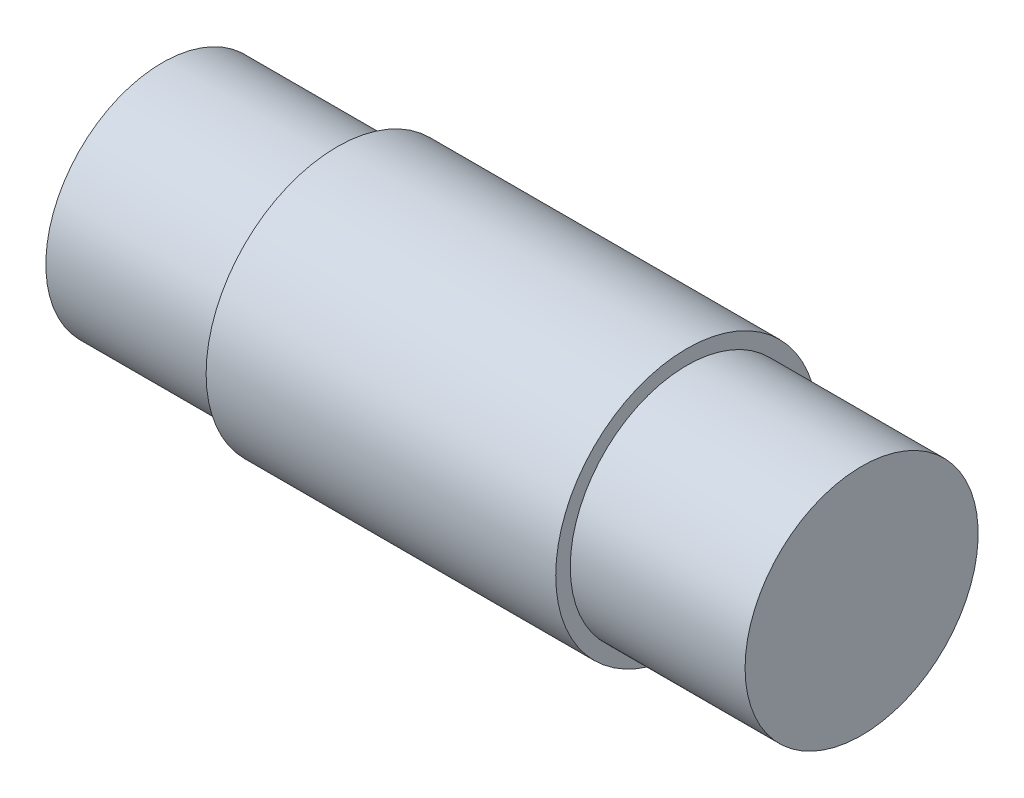
ISO-10303-21;
HEADER;
FILE_DESCRIPTION(('STEP AP214'),'2;1');
FILE_NAME('part.step','',(''),(''),'','','');
FILE_SCHEMA(('AUTOMOTIVE_DESIGN { 1 0 10303 214 1 1 1 1 }'));
ENDSEC;
DATA;
#1=APPLICATION_CONTEXT('core data for automotive mechanical design processes');
#2=APPLICATION_PROTOCOL_DEFINITION('international standard','automotive_design',2000,#1);
#3=PRODUCT_CONTEXT('',#1,'mechanical');
#4=PRODUCT('Part','Part','',(#3));
#5=PRODUCT_RELATED_PRODUCT_CATEGORY('part','',(#4));
#6=PRODUCT_DEFINITION_FORMATION('','',#4);
#7=PRODUCT_DEFINITION_CONTEXT('part definition',#1,'design');
#8=PRODUCT_DEFINITION('design','',#6,#7);
#9=PRODUCT_DEFINITION_SHAPE('','',#8);
#10=(LENGTH_UNIT() NAMED_UNIT(*) SI_UNIT(.MILLI.,.METRE.));
#11=(NAMED_UNIT(*) PLANE_ANGLE_UNIT() SI_UNIT($,.RADIAN.));
#12=(NAMED_UNIT(*) SI_UNIT($,.STERADIAN.) SOLID_ANGLE_UNIT());
#13=UNCERTAINTY_MEASURE_WITH_UNIT(LENGTH_MEASURE(1.E-05),#10,'distance_accuracy_value','');
#14=(GEOMETRIC_REPRESENTATION_CONTEXT(3) GLOBAL_UNCERTAINTY_ASSIGNED_CONTEXT((#13)) GLOBAL_UNIT_ASSIGNED_CONTEXT((#10,
#11,#12)) REPRESENTATION_CONTEXT('',''));
#15=CARTESIAN_POINT('',(0.,0.,0.));
#16=DIRECTION('',(0.,0.,1.));
#17=DIRECTION('',(1.,0.,0.));
#18=AXIS2_PLACEMENT_3D('',#15,#16,#17);
#19=CARTESIAN_POINT('',(2.38125,0.,0.));
#20=DIRECTION('',(-1.,0.,0.));
#21=DIRECTION('',(0.,0.,1.));
#22=AXIS2_PLACEMENT_3D('',#19,#20,#21);
#23=CYLINDRICAL_SURFACE('',#22,3.175);
#24=CARTESIAN_POINT('',(2.38125,0.,0.));
#25=DIRECTION('',(1.,0.,0.));
#26=DIRECTION('',(0.,0.,-1.));
#27=AXIS2_PLACEMENT_3D('',#24,#25,#26);
#28=CIRCLE('',#27,3.175);
#29=CARTESIAN_POINT('',(2.38125,0.,3.175));
#30=VERTEX_POINT('',#29);
#31=EDGE_CURVE('E42',#30,#30,#28,.T.);
#32=CARTESIAN_POINT('',(-2.38125,0.,0.));
#33=DIRECTION('',(1.,0.,0.));
#34=DIRECTION('',(0.,0.,-1.));
#35=AXIS2_PLACEMENT_3D('',#32,#33,#34);
#36=CIRCLE('',#35,3.175);
#37=CARTESIAN_POINT('',(-2.38125,0.,3.175));
#38=VERTEX_POINT('',#37);
#39=EDGE_CURVE('E38',#38,#38,#36,.T.);
#40=CARTESIAN_POINT('',(2.38125,0.,3.175));
#41=CARTESIAN_POINT('',(2.331640625,0.,3.175));
#42=CARTESIAN_POINT('',(2.28203125,0.,3.175));
#43=CARTESIAN_POINT('',(2.1828125,0.,3.175));
#44=CARTESIAN_POINT('',(2.133203125,0.,3.175));
#45=CARTESIAN_POINT('',(2.033984375,0.,3.175));
#46=CARTESIAN_POINT('',(1.984375,0.,3.175));
#47=CARTESIAN_POINT('',(1.88515625,0.,3.175));
#48=CARTESIAN_POINT('',(1.835546875,0.,3.175));
#49=CARTESIAN_POINT('',(1.736328125,0.,3.175));
#50=CARTESIAN_POINT('',(1.68671875,0.,3.175));
#51=CARTESIAN_POINT('',(1.5875,0.,3.175));
#52=CARTESIAN_POINT('',(1.537890625,0.,3.175));
#53=CARTESIAN_POINT('',(1.438671875,0.,3.175));
#54=CARTESIAN_POINT('',(1.3890625,0.,3.175));
#55=CARTESIAN_POINT('',(1.28984375,0.,3.175));
#56=CARTESIAN_POINT('',(1.240234375,0.,3.175));
#57=CARTESIAN_POINT('',(1.141015625,0.,3.175));
#58=CARTESIAN_POINT('',(1.09140625,0.,3.175));
#59=CARTESIAN_POINT('',(0.9921875,0.,3.175));
#60=CARTESIAN_POINT('',(0.942578125,0.,3.175));
#61=CARTESIAN_POINT('',(0.843359375,0.,3.175));
#62=CARTESIAN_POINT('',(0.79375,0.,3.175));
#63=CARTESIAN_POINT('',(0.69453125,0.,3.175));
#64=CARTESIAN_POINT('',(0.644921875,0.,3.175));
#65=CARTESIAN_POINT('',(0.545703125,0.,3.175));
#66=CARTESIAN_POINT('',(0.49609375,0.,3.175));
#67=CARTESIAN_POINT('',(0.396875,0.,3.175));
#68=CARTESIAN_POINT('',(0.347265625,0.,3.175));
#69=CARTESIAN_POINT('',(0.248046875,0.,3.175));
#70=CARTESIAN_POINT('',(0.1984375,0.,3.175));
#71=CARTESIAN_POINT('',(0.0992187499999996,0.,3.175));
#72=CARTESIAN_POINT('',(0.0496093749999996,0.,3.175));
#73=CARTESIAN_POINT('',(-0.0496093750000005,0.,3.175));
#74=CARTESIAN_POINT('',(-0.0992187500000005,0.,3.175));
#75=CARTESIAN_POINT('',(-0.198437500000001,0.,3.175));
#76=CARTESIAN_POINT('',(-0.248046875000001,0.,3.175));
#77=CARTESIAN_POINT('',(-0.347265625000001,0.,3.175));
#78=CARTESIAN_POINT('',(-0.396875000000001,0.,3.175));
#79=CARTESIAN_POINT('',(-0.496093750000001,0.,3.175));
#80=CARTESIAN_POINT('',(-0.545703125000001,0.,3.175));
#81=CARTESIAN_POINT('',(-0.644921875000001,0.,3.175));
#82=CARTESIAN_POINT('',(-0.694531250000001,0.,3.175));
#83=CARTESIAN_POINT('',(-0.793750000000001,0.,3.175));
#84=CARTESIAN_POINT('',(-0.843359375,0.,3.175));
#85=CARTESIAN_POINT('',(-0.942578125000001,0.,3.175));
#86=CARTESIAN_POINT('',(-0.992187500000001,0.,3.175));
#87=CARTESIAN_POINT('',(-1.09140625,0.,3.175));
#88=CARTESIAN_POINT('',(-1.141015625,0.,3.175));
#89=CARTESIAN_POINT('',(-1.240234375,0.,3.175));
#90=CARTESIAN_POINT('',(-1.28984375,0.,3.175));
#91=CARTESIAN_POINT('',(-1.3890625,0.,3.175));
#92=CARTESIAN_POINT('',(-1.438671875,0.,3.175));
#93=CARTESIAN_POINT('',(-1.537890625,0.,3.175));
#94=CARTESIAN_POINT('',(-1.5875,0.,3.175));
#95=CARTESIAN_POINT('',(-1.68671875,0.,3.175));
#96=CARTESIAN_POINT('',(-1.736328125,0.,3.175));
#97=CARTESIAN_POINT('',(-1.835546875,0.,3.175));
#98=CARTESIAN_POINT('',(-1.88515625,0.,3.175));
#99=CARTESIAN_POINT('',(-1.984375,0.,3.175));
#100=CARTESIAN_POINT('',(-2.033984375,0.,3.175));
#101=CARTESIAN_POINT('',(-2.133203125,0.,3.175));
#102=CARTESIAN_POINT('',(-2.1828125,0.,3.175));
#103=CARTESIAN_POINT('',(-2.28203125,0.,3.175));
#104=CARTESIAN_POINT('',(-2.331640625,0.,3.175));
#105=CARTESIAN_POINT('',(-2.38125,0.,3.175));
#106=B_SPLINE_CURVE_WITH_KNOTS('',3,(#40,#41,#42,#43,#44,#45,#46,#47,#48,#49,#50,#51,#52,#53,
#54,#55,#56,#57,#58,#59,#60,#61,#62,#63,#64,#65,#66,#67,#68,#69,#70,#71,#72,#73,#74,#75,#76,#77,
#78,#79,#80,#81,#82,#83,#84,#85,#86,#87,#88,#89,#90,#91,#92,#93,#94,#95,#96,#97,#98,#99,#100,
#101,#102,#103,#104,#105),.UNSPECIFIED.,.F.,.F.,(4,2,2,2,2,2,2,2,2,2,2,2,2,2,2,2,2,2,2,2,2,2,2,
2,2,2,2,2,2,2,2,2,4),(0.,0.148828125,0.29765625,0.446484375,0.5953125,0.744140625,0.89296875,
1.041796875,1.190625,1.339453125,1.48828125,1.637109375,1.7859375,1.934765625,2.08359375,
2.232421875,2.38125,2.530078125,2.67890625,2.827734375,2.9765625,3.125390625,3.27421875,
3.423046875,3.571875,3.720703125,3.86953125,4.018359375,4.1671875,4.316015625,4.46484375,
4.613671875,4.7625),.UNSPECIFIED.);
#107=EDGE_CURVE('BSEAM35',#30,#38,#106,.T.);
#108=ORIENTED_EDGE('',*,*,#31,.F.);
#109=ORIENTED_EDGE('',*,*,#39,.T.);
#110=ORIENTED_EDGE('',*,*,#107,.T.);
#111=ORIENTED_EDGE('',*,*,#107,.F.);
#112=EDGE_LOOP('',(#108,#110,#109,#111));
#113=FACE_BOUND('',#112,.T.);
#114=ADVANCED_FACE('F35',(#113),#23,.T.);
#115=CARTESIAN_POINT('',(2.38125,0.,0.));
#116=DIRECTION('',(1.,0.,0.));
#117=DIRECTION('',(0.,0.,-1.));
#118=AXIS2_PLACEMENT_3D('',#115,#116,#117);
#119=PLANE('',#118);
#120=ORIENTED_EDGE('',*,*,#31,.T.);
#121=EDGE_LOOP('',(#120));
#122=FACE_BOUND('',#121,.T.);
#123=ADVANCED_FACE('F76',(#122),#119,.T.);
#124=CARTESIAN_POINT('',(-11.90625,0.,0.));
#125=DIRECTION('',(1.,0.,0.));
#126=DIRECTION('',(0.,0.,-1.));
#127=AXIS2_PLACEMENT_3D('',#124,#125,#126);
#128=CYLINDRICAL_SURFACE('',#127,3.57124);
#129=CARTESIAN_POINT('',(-11.90625,0.,0.));
#130=DIRECTION('',(-1.,0.,0.));
#131=DIRECTION('',(0.,0.,1.));
#132=AXIS2_PLACEMENT_3D('',#129,#130,#131);
#133=CIRCLE('',#132,3.57124);
#134=CARTESIAN_POINT('',(-11.90625,0.,-3.57124));
#135=VERTEX_POINT('',#134);
#136=EDGE_CURVE('E50',#135,#135,#133,.T.);
#137=CARTESIAN_POINT('',(-2.38125,0.,0.));
#138=DIRECTION('',(-1.,0.,0.));
#139=DIRECTION('',(0.,0.,1.));
#140=AXIS2_PLACEMENT_3D('',#137,#138,#139);
#141=CIRCLE('',#140,3.57124);
#142=CARTESIAN_POINT('',(-2.38125,0.,-3.57124));
#143=VERTEX_POINT('',#142);
#144=EDGE_CURVE('E53',#143,#143,#141,.T.);
#145=CARTESIAN_POINT('',(-11.90625,0.,-3.57124));
#146=CARTESIAN_POINT('',(-11.80703125,0.,-3.57124));
#147=CARTESIAN_POINT('',(-11.7078125,0.,-3.57124));
#148=CARTESIAN_POINT('',(-11.509375,0.,-3.57124));
#149=CARTESIAN_POINT('',(-11.41015625,0.,-3.57124));
#150=CARTESIAN_POINT('',(-11.21171875,0.,-3.57124));
#151=CARTESIAN_POINT('',(-11.1125,0.,-3.57124));
#152=CARTESIAN_POINT('',(-10.9140625,0.,-3.57124));
#153=CARTESIAN_POINT('',(-10.81484375,0.,-3.57124));
#154=CARTESIAN_POINT('',(-10.61640625,0.,-3.57124));
#155=CARTESIAN_POINT('',(-10.5171875,0.,-3.57124));
#156=CARTESIAN_POINT('',(-10.31875,0.,-3.57124));
#157=CARTESIAN_POINT('',(-10.21953125,0.,-3.57124));
#158=CARTESIAN_POINT('',(-10.02109375,0.,-3.57124));
#159=CARTESIAN_POINT('',(-9.921875,0.,-3.57124));
#160=CARTESIAN_POINT('',(-9.7234375,0.,-3.57124));
#161=CARTESIAN_POINT('',(-9.62421875,0.,-3.57124));
#162=CARTESIAN_POINT('',(-9.42578125,0.,-3.57124));
#163=CARTESIAN_POINT('',(-9.3265625,0.,-3.57124));
#164=CARTESIAN_POINT('',(-9.128125,0.,-3.57124));
#165=CARTESIAN_POINT('',(-9.02890625,0.,-3.57124));
#166=CARTESIAN_POINT('',(-8.83046875,0.,-3.57124));
#167=CARTESIAN_POINT('',(-8.73125,0.,-3.57124));
#168=CARTESIAN_POINT('',(-8.5328125,0.,-3.57124));
#169=CARTESIAN_POINT('',(-8.43359375,0.,-3.57124));
#170=CARTESIAN_POINT('',(-8.23515625,0.,-3.57124));
#171=CARTESIAN_POINT('',(-8.1359375,0.,-3.57124));
#172=CARTESIAN_POINT('',(-7.9375,0.,-3.57124));
#173=CARTESIAN_POINT('',(-7.83828125,0.,-3.57124));
#174=CARTESIAN_POINT('',(-7.63984375,0.,-3.57124));
#175=CARTESIAN_POINT('',(-7.540625,0.,-3.57124));
#176=CARTESIAN_POINT('',(-7.3421875,0.,-3.57124));
#177=CARTESIAN_POINT('',(-7.24296875,0.,-3.57124));
#178=CARTESIAN_POINT('',(-7.04453125,0.,-3.57124));
#179=CARTESIAN_POINT('',(-6.9453125,0.,-3.57124));
#180=CARTESIAN_POINT('',(-6.746875,0.,-3.57124));
#181=CARTESIAN_POINT('',(-6.64765625,0.,-3.57124));
#182=CARTESIAN_POINT('',(-6.44921875,0.,-3.57124));
#183=CARTESIAN_POINT('',(-6.35,0.,-3.57124));
#184=CARTESIAN_POINT('',(-6.1515625,0.,-3.57124));
#185=CARTESIAN_POINT('',(-6.05234375,0.,-3.57124));
#186=CARTESIAN_POINT('',(-5.85390625,0.,-3.57124));
#187=CARTESIAN_POINT('',(-5.7546875,0.,-3.57124));
#188=CARTESIAN_POINT('',(-5.55625,0.,-3.57124));
#189=CARTESIAN_POINT('',(-5.45703125,0.,-3.57124));
#190=CARTESIAN_POINT('',(-5.25859375,0.,-3.57124));
#191=CARTESIAN_POINT('',(-5.159375,0.,-3.57124));
#192=CARTESIAN_POINT('',(-4.9609375,0.,-3.57124));
#193=CARTESIAN_POINT('',(-4.86171875,0.,-3.57124));
#194=CARTESIAN_POINT('',(-4.66328125,0.,-3.57124));
#195=CARTESIAN_POINT('',(-4.5640625,0.,-3.57124));
#196=CARTESIAN_POINT('',(-4.365625,0.,-3.57124));
#197=CARTESIAN_POINT('',(-4.26640625,0.,-3.57124));
#198=CARTESIAN_POINT('',(-4.06796875,0.,-3.57124));
#199=CARTESIAN_POINT('',(-3.96875,0.,-3.57124));
#200=CARTESIAN_POINT('',(-3.7703125,0.,-3.57124));
#201=CARTESIAN_POINT('',(-3.67109375,0.,-3.57124));
#202=CARTESIAN_POINT('',(-3.47265625,0.,-3.57124));
#203=CARTESIAN_POINT('',(-3.3734375,0.,-3.57124));
#204=CARTESIAN_POINT('',(-3.175,0.,-3.57124));
#205=CARTESIAN_POINT('',(-3.07578125,0.,-3.57124));
#206=CARTESIAN_POINT('',(-2.87734375,0.,-3.57124));
#207=CARTESIAN_POINT('',(-2.778125,0.,-3.57124));
#208=CARTESIAN_POINT('',(-2.5796875,0.,-3.57124));
#209=CARTESIAN_POINT('',(-2.48046875,0.,-3.57124));
#210=CARTESIAN_POINT('',(-2.38125,0.,-3.57124));
#211=B_SPLINE_CURVE_WITH_KNOTS('',3,(#145,#146,#147,#148,#149,#150,#151,#152,#153,#154,#155,
#156,#157,#158,#159,#160,#161,#162,#163,#164,#165,#166,#167,#168,#169,#170,#171,#172,#173,#174,
#175,#176,#177,#178,#179,#180,#181,#182,#183,#184,#185,#186,#187,#188,#189,#190,#191,#192,#193,
#194,#195,#196,#197,#198,#199,#200,#201,#202,#203,#204,#205,#206,#207,#208,#209,#210),
.UNSPECIFIED.,.F.,.F.,(4,2,2,2,2,2,2,2,2,2,2,2,2,2,2,2,2,2,2,2,2,2,2,2,2,2,2,2,2,2,2,2,4),(0.,
0.297656249999998,0.595312499999999,0.892968749999999,1.190625,1.48828125,1.7859375,2.08359375,
2.38125,2.67890625,2.9765625,3.27421875,3.571875,3.86953125,4.1671875,4.46484375,4.7625,
5.06015625,5.3578125,5.65546875,5.953125,6.25078125,6.5484375,6.84609375,7.14375,7.44140625,
7.7390625,8.03671875,8.334375,8.63203125,8.9296875,9.22734375,9.525),.UNSPECIFIED.);
#212=EDGE_CURVE('BSEAM81',#135,#143,#211,.T.);
#213=ORIENTED_EDGE('',*,*,#136,.F.);
#214=ORIENTED_EDGE('',*,*,#144,.T.);
#215=ORIENTED_EDGE('',*,*,#212,.T.);
#216=ORIENTED_EDGE('',*,*,#212,.F.);
#217=EDGE_LOOP('',(#213,#215,#214,#216));
#218=FACE_BOUND('',#217,.T.);
#219=ADVANCED_FACE('F81',(#218),#128,.T.);
#220=CARTESIAN_POINT('',(-11.90625,0.,0.));
#221=DIRECTION('',(-1.,0.,0.));
#222=DIRECTION('',(0.,0.,1.));
#223=AXIS2_PLACEMENT_3D('',#220,#221,#222);
#224=PLANE('',#223);
#225=CARTESIAN_POINT('',(-11.90625,0.,0.));
#226=DIRECTION('',(-1.,0.,0.));
#227=DIRECTION('',(0.,0.,1.));
#228=AXIS2_PLACEMENT_3D('',#225,#226,#227);
#229=CIRCLE('',#228,3.175);
#230=CARTESIAN_POINT('',(-11.90625,0.,-3.175));
#231=VERTEX_POINT('',#230);
#232=EDGE_CURVE('E10',#231,#231,#229,.T.);
#233=ORIENTED_EDGE('',*,*,#232,.F.);
#234=EDGE_LOOP('',(#233));
#235=FACE_BOUND('',#234,.T.);
#236=ORIENTED_EDGE('',*,*,#136,.T.);
#237=EDGE_LOOP('',(#236));
#238=FACE_BOUND('',#237,.T.);
#239=ADVANCED_FACE('F71',(#235,#238),#224,.T.);
#240=CARTESIAN_POINT('',(-2.38125,0.,0.));
#241=DIRECTION('',(-1.,0.,0.));
#242=DIRECTION('',(0.,0.,1.));
#243=AXIS2_PLACEMENT_3D('',#240,#241,#242);
#244=PLANE('',#243);
#245=ORIENTED_EDGE('',*,*,#39,.F.);
#246=EDGE_LOOP('',(#245));
#247=FACE_BOUND('',#246,.T.);
#248=ORIENTED_EDGE('',*,*,#144,.F.);
#249=EDGE_LOOP('',(#248));
#250=FACE_BOUND('',#249,.T.);
#251=ADVANCED_FACE('F64',(#247,#250),#244,.F.);
#252=CARTESIAN_POINT('',(-16.66875,0.,0.));
#253=DIRECTION('',(1.,0.,0.));
#254=DIRECTION('',(0.,0.,-1.));
#255=AXIS2_PLACEMENT_3D('',#252,#253,#254);
#256=CYLINDRICAL_SURFACE('',#255,3.175);
#257=CARTESIAN_POINT('',(-16.66875,0.,0.));
#258=DIRECTION('',(-1.,0.,0.));
#259=DIRECTION('',(0.,0.,1.));
#260=AXIS2_PLACEMENT_3D('',#257,#258,#259);
#261=CIRCLE('',#260,3.175);
#262=CARTESIAN_POINT('',(-16.66875,0.,-3.175));
#263=VERTEX_POINT('',#262);
#264=EDGE_CURVE('E49',#263,#263,#261,.T.);
#265=CARTESIAN_POINT('',(-16.66875,0.,-3.175));
#266=CARTESIAN_POINT('',(-16.619140625,0.,-3.175));
#267=CARTESIAN_POINT('',(-16.56953125,0.,-3.175));
#268=CARTESIAN_POINT('',(-16.4703125,0.,-3.175));
#269=CARTESIAN_POINT('',(-16.420703125,0.,-3.175));
#270=CARTESIAN_POINT('',(-16.321484375,0.,-3.175));
#271=CARTESIAN_POINT('',(-16.271875,0.,-3.175));
#272=CARTESIAN_POINT('',(-16.17265625,0.,-3.175));
#273=CARTESIAN_POINT('',(-16.123046875,0.,-3.175));
#274=CARTESIAN_POINT('',(-16.023828125,0.,-3.175));
#275=CARTESIAN_POINT('',(-15.97421875,0.,-3.175));
#276=CARTESIAN_POINT('',(-15.875,0.,-3.175));
#277=CARTESIAN_POINT('',(-15.825390625,0.,-3.175));
#278=CARTESIAN_POINT('',(-15.726171875,0.,-3.175));
#279=CARTESIAN_POINT('',(-15.6765625,0.,-3.175));
#280=CARTESIAN_POINT('',(-15.57734375,0.,-3.175));
#281=CARTESIAN_POINT('',(-15.527734375,0.,-3.175));
#282=CARTESIAN_POINT('',(-15.428515625,0.,-3.175));
#283=CARTESIAN_POINT('',(-15.37890625,0.,-3.175));
#284=CARTESIAN_POINT('',(-15.2796875,0.,-3.175));
#285=CARTESIAN_POINT('',(-15.230078125,0.,-3.175));
#286=CARTESIAN_POINT('',(-15.130859375,0.,-3.175));
#287=CARTESIAN_POINT('',(-15.08125,0.,-3.175));
#288=CARTESIAN_POINT('',(-14.98203125,0.,-3.175));
#289=CARTESIAN_POINT('',(-14.932421875,0.,-3.175));
#290=CARTESIAN_POINT('',(-14.833203125,0.,-3.175));
#291=CARTESIAN_POINT('',(-14.78359375,0.,-3.175));
#292=CARTESIAN_POINT('',(-14.684375,0.,-3.175));
#293=CARTESIAN_POINT('',(-14.634765625,0.,-3.175));
#294=CARTESIAN_POINT('',(-14.535546875,0.,-3.175));
#295=CARTESIAN_POINT('',(-14.4859375,0.,-3.175));
#296=CARTESIAN_POINT('',(-14.38671875,0.,-3.175));
#297=CARTESIAN_POINT('',(-14.337109375,0.,-3.175));
#298=CARTESIAN_POINT('',(-14.237890625,0.,-3.175));
#299=CARTESIAN_POINT('',(-14.18828125,0.,-3.175));
#300=CARTESIAN_POINT('',(-14.0890625,0.,-3.175));
#301=CARTESIAN_POINT('',(-14.039453125,0.,-3.175));
#302=CARTESIAN_POINT('',(-13.940234375,0.,-3.175));
#303=CARTESIAN_POINT('',(-13.890625,0.,-3.175));
#304=CARTESIAN_POINT('',(-13.79140625,0.,-3.175));
#305=CARTESIAN_POINT('',(-13.741796875,0.,-3.175));
#306=CARTESIAN_POINT('',(-13.642578125,0.,-3.175));
#307=CARTESIAN_POINT('',(-13.59296875,0.,-3.175));
#308=CARTESIAN_POINT('',(-13.49375,0.,-3.175));
#309=CARTESIAN_POINT('',(-13.444140625,0.,-3.175));
#310=CARTESIAN_POINT('',(-13.344921875,0.,-3.175));
#311=CARTESIAN_POINT('',(-13.2953125,0.,-3.175));
#312=CARTESIAN_POINT('',(-13.19609375,0.,-3.175));
#313=CARTESIAN_POINT('',(-13.146484375,0.,-3.175));
#314=CARTESIAN_POINT('',(-13.047265625,0.,-3.175));
#315=CARTESIAN_POINT('',(-12.99765625,0.,-3.175));
#316=CARTESIAN_POINT('',(-12.8984375,0.,-3.175));
#317=CARTESIAN_POINT('',(-12.848828125,0.,-3.175));
#318=CARTESIAN_POINT('',(-12.749609375,0.,-3.175));
#319=CARTESIAN_POINT('',(-12.7,0.,-3.175));
#320=CARTESIAN_POINT('',(-12.60078125,0.,-3.175));
#321=CARTESIAN_POINT('',(-12.551171875,0.,-3.175));
#322=CARTESIAN_POINT('',(-12.451953125,0.,-3.175));
#323=CARTESIAN_POINT('',(-12.40234375,0.,-3.175));
#324=CARTESIAN_POINT('',(-12.303125,0.,-3.175));
#325=CARTESIAN_POINT('',(-12.253515625,0.,-3.175));
#326=CARTESIAN_POINT('',(-12.154296875,0.,-3.175));
#327=CARTESIAN_POINT('',(-12.1046875,0.,-3.175));
#328=CARTESIAN_POINT('',(-12.00546875,0.,-3.175));
#329=CARTESIAN_POINT('',(-11.955859375,0.,-3.175));
#330=CARTESIAN_POINT('',(-11.90625,0.,-3.175));
#331=B_SPLINE_CURVE_WITH_KNOTS('',3,(#265,#266,#267,#268,#269,#270,#271,#272,#273,#274,#275,
#276,#277,#278,#279,#280,#281,#282,#283,#284,#285,#286,#287,#288,#289,#290,#291,#292,#293,#294,
#295,#296,#297,#298,#299,#300,#301,#302,#303,#304,#305,#306,#307,#308,#309,#310,#311,#312,#313,
#314,#315,#316,#317,#318,#319,#320,#321,#322,#323,#324,#325,#326,#327,#328,#329,#330),
.UNSPECIFIED.,.F.,.F.,(4,2,2,2,2,2,2,2,2,2,2,2,2,2,2,2,2,2,2,2,2,2,2,2,2,2,2,2,2,2,2,2,4),(0.,
0.148828125,0.29765625,0.446484375,0.5953125,0.744140625,0.892968750000001,1.041796875,1.190625,
1.339453125,1.48828125,1.637109375,1.7859375,1.934765625,2.08359375,2.232421875,2.38125,
2.530078125,2.67890625,2.827734375,2.9765625,3.125390625,3.27421875,3.423046875,3.571875,
3.720703125,3.86953125,4.018359375,4.1671875,4.316015625,4.46484375,4.613671875,4.7625),.UNSPECIFIED.);
#332=EDGE_CURVE('BSEAM62',#263,#231,#331,.T.);
#333=ORIENTED_EDGE('',*,*,#264,.F.);
#334=ORIENTED_EDGE('',*,*,#232,.T.);
#335=ORIENTED_EDGE('',*,*,#332,.T.);
#336=ORIENTED_EDGE('',*,*,#332,.F.);
#337=EDGE_LOOP('',(#333,#335,#334,#336));
#338=FACE_BOUND('',#337,.T.);
#339=ADVANCED_FACE('F62',(#338),#256,.T.);
#340=CARTESIAN_POINT('',(-16.66875,0.,0.));
#341=DIRECTION('',(-1.,0.,0.));
#342=DIRECTION('',(0.,0.,1.));
#343=AXIS2_PLACEMENT_3D('',#340,#341,#342);
#344=PLANE('',#343);
#345=ORIENTED_EDGE('',*,*,#264,.T.);
#346=EDGE_LOOP('',(#345));
#347=FACE_BOUND('',#346,.T.);
#348=ADVANCED_FACE('F60',(#347),#344,.T.);
#349=CLOSED_SHELL('',(#114,#123,#219,#239,#251,#339,#348));
#350=MANIFOLD_SOLID_BREP('B2',#349);
#351=ADVANCED_BREP_SHAPE_REPRESENTATION('',(#18,#350),#14);
#352=SHAPE_DEFINITION_REPRESENTATION(#9,#351);
ENDSEC;
END-ISO-10303-21;
